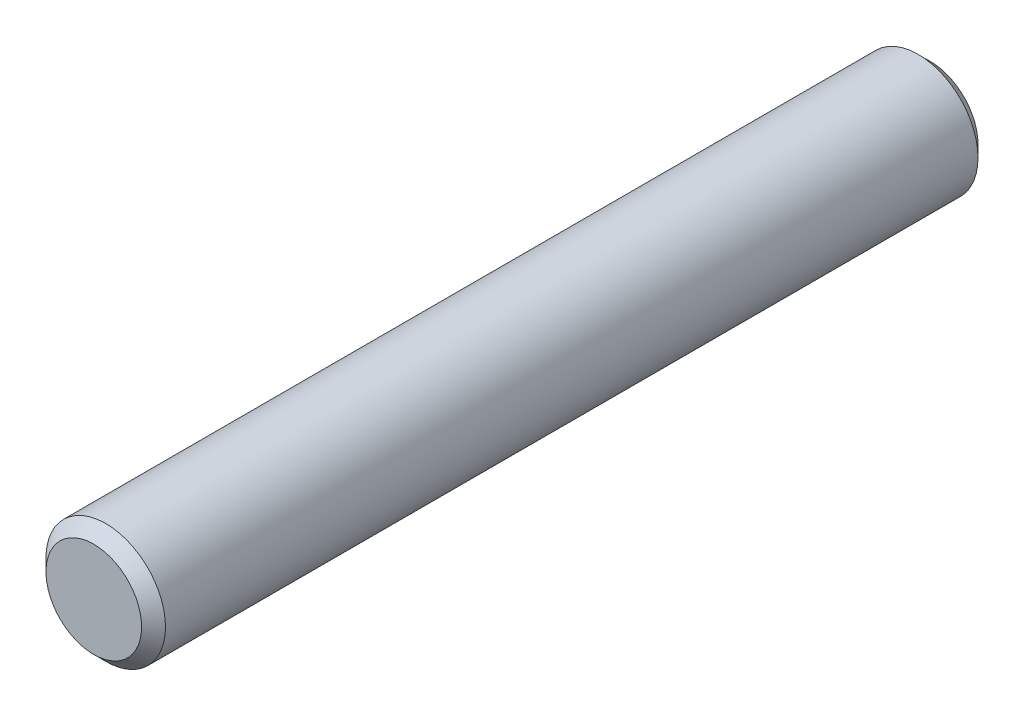
ISO-10303-21;
HEADER;
FILE_DESCRIPTION(('STEP AP214'),'2;1');
FILE_NAME('part.step','',(''),(''),'','','');
FILE_SCHEMA(('AUTOMOTIVE_DESIGN { 1 0 10303 214 1 1 1 1 }'));
ENDSEC;
DATA;
#1=APPLICATION_CONTEXT('core data for automotive mechanical design processes');
#2=APPLICATION_PROTOCOL_DEFINITION('international standard','automotive_design',2000,#1);
#3=PRODUCT_CONTEXT('',#1,'mechanical');
#4=PRODUCT('Part','Part','',(#3));
#5=PRODUCT_RELATED_PRODUCT_CATEGORY('part','',(#4));
#6=PRODUCT_DEFINITION_FORMATION('','',#4);
#7=PRODUCT_DEFINITION_CONTEXT('part definition',#1,'design');
#8=PRODUCT_DEFINITION('design','',#6,#7);
#9=PRODUCT_DEFINITION_SHAPE('','',#8);
#10=(LENGTH_UNIT() NAMED_UNIT(*) SI_UNIT(.MILLI.,.METRE.));
#11=(NAMED_UNIT(*) PLANE_ANGLE_UNIT() SI_UNIT($,.RADIAN.));
#12=(NAMED_UNIT(*) SI_UNIT($,.STERADIAN.) SOLID_ANGLE_UNIT());
#13=UNCERTAINTY_MEASURE_WITH_UNIT(LENGTH_MEASURE(1.E-05),#10,'distance_accuracy_value','');
#14=(GEOMETRIC_REPRESENTATION_CONTEXT(3) GLOBAL_UNCERTAINTY_ASSIGNED_CONTEXT((#13)) GLOBAL_UNIT_ASSIGNED_CONTEXT((#10,
#11,#12)) REPRESENTATION_CONTEXT('',''));
#15=CARTESIAN_POINT('',(0.,0.,0.));
#16=DIRECTION('',(0.,0.,1.));
#17=DIRECTION('',(1.,0.,0.));
#18=AXIS2_PLACEMENT_3D('',#15,#16,#17);
#19=CARTESIAN_POINT('',(0.,0.,70.));
#20=DIRECTION('',(0.,0.,-1.));
#21=DIRECTION('',(-1.,0.,0.));
#22=AXIS2_PLACEMENT_3D('',#19,#20,#21);
#23=CYLINDRICAL_SURFACE('',#22,5.);
#24=CARTESIAN_POINT('',(0.,0.,1.));
#25=DIRECTION('',(0.,0.,1.));
#26=DIRECTION('',(1.,0.,0.));
#27=AXIS2_PLACEMENT_3D('',#24,#25,#26);
#28=CIRCLE('',#27,5.);
#29=CARTESIAN_POINT('',(5.,0.,1.));
#30=VERTEX_POINT('',#29);
#31=EDGE_CURVE('E53',#30,#30,#28,.T.);
#32=ORIENTED_EDGE('',*,*,#31,.T.);
#33=EDGE_LOOP('',(#32));
#34=FACE_BOUND('',#33,.T.);
#35=CARTESIAN_POINT('',(0.,0.,69.));
#36=DIRECTION('',(0.,0.,1.));
#37=DIRECTION('',(1.,0.,0.));
#38=AXIS2_PLACEMENT_3D('',#35,#36,#37);
#39=CIRCLE('',#38,5.);
#40=CARTESIAN_POINT('',(5.,0.,69.));
#41=VERTEX_POINT('',#40);
#42=EDGE_CURVE('E58',#41,#41,#39,.F.);
#43=ORIENTED_EDGE('',*,*,#42,.T.);
#44=EDGE_LOOP('',(#43));
#45=FACE_BOUND('',#44,.T.);
#46=ADVANCED_FACE('F39',(#34,#45),#23,.T.);
#47=CARTESIAN_POINT('',(0.,0.,70.));
#48=DIRECTION('',(0.,0.,1.));
#49=DIRECTION('',(1.,0.,0.));
#50=AXIS2_PLACEMENT_3D('',#47,#48,#49);
#51=PLANE('',#50);
#52=CARTESIAN_POINT('',(0.,0.,70.));
#53=DIRECTION('',(0.,0.,1.));
#54=DIRECTION('',(1.,0.,0.));
#55=AXIS2_PLACEMENT_3D('',#52,#53,#54);
#56=CIRCLE('',#55,4.00000000000002);
#57=CARTESIAN_POINT('',(4.00000000000002,0.,70.));
#58=VERTEX_POINT('',#57);
#59=EDGE_CURVE('E10',#58,#58,#56,.T.);
#60=ORIENTED_EDGE('',*,*,#59,.T.);
#61=EDGE_LOOP('',(#60));
#62=FACE_BOUND('',#61,.T.);
#63=ADVANCED_FACE('F75',(#62),#51,.T.);
#64=CARTESIAN_POINT('',(0.,0.,0.));
#65=DIRECTION('',(0.,0.,1.));
#66=DIRECTION('',(1.,0.,0.));
#67=AXIS2_PLACEMENT_3D('',#64,#65,#66);
#68=PLANE('',#67);
#69=CARTESIAN_POINT('',(0.,0.,0.));
#70=DIRECTION('',(0.,0.,1.));
#71=DIRECTION('',(1.,0.,0.));
#72=AXIS2_PLACEMENT_3D('',#69,#70,#71);
#73=CIRCLE('',#72,4.);
#74=CARTESIAN_POINT('',(4.,0.,0.));
#75=VERTEX_POINT('',#74);
#76=EDGE_CURVE('E48',#75,#75,#73,.F.);
#77=ORIENTED_EDGE('',*,*,#76,.T.);
#78=EDGE_LOOP('',(#77));
#79=FACE_BOUND('',#78,.T.);
#80=ADVANCED_FACE('F72',(#79),#68,.F.);
#81=CARTESIAN_POINT('',(0.,0.,1.));
#82=DIRECTION('',(0.,0.,1.));
#83=DIRECTION('',(1.,0.,0.));
#84=AXIS2_PLACEMENT_3D('',#81,#82,#83);
#85=CONICAL_SURFACE('',#84,5.,0.78539816339745);
#86=ORIENTED_EDGE('',*,*,#76,.F.);
#87=EDGE_LOOP('',(#86));
#88=FACE_BOUND('',#87,.T.);
#89=ORIENTED_EDGE('',*,*,#31,.F.);
#90=EDGE_LOOP('',(#89));
#91=FACE_BOUND('',#90,.T.);
#92=ADVANCED_FACE('F68',(#88,#91),#85,.T.);
#93=CARTESIAN_POINT('',(0.,0.,70.));
#94=DIRECTION('',(0.,0.,-1.));
#95=DIRECTION('',(-1.,0.,0.));
#96=AXIS2_PLACEMENT_3D('',#93,#94,#95);
#97=CONICAL_SURFACE('',#96,4.00000000000002,0.785398163397446);
#98=ORIENTED_EDGE('',*,*,#42,.F.);
#99=EDGE_LOOP('',(#98));
#100=FACE_BOUND('',#99,.T.);
#101=ORIENTED_EDGE('',*,*,#59,.F.);
#102=EDGE_LOOP('',(#101));
#103=FACE_BOUND('',#102,.T.);
#104=ADVANCED_FACE('F42',(#100,#103),#97,.T.);
#105=CLOSED_SHELL('',(#46,#63,#80,#92,#104));
#106=MANIFOLD_SOLID_BREP('B2',#105);
#107=ADVANCED_BREP_SHAPE_REPRESENTATION('',(#18,#106),#14);
#108=SHAPE_DEFINITION_REPRESENTATION(#9,#107);
ENDSEC;
END-ISO-10303-21;
